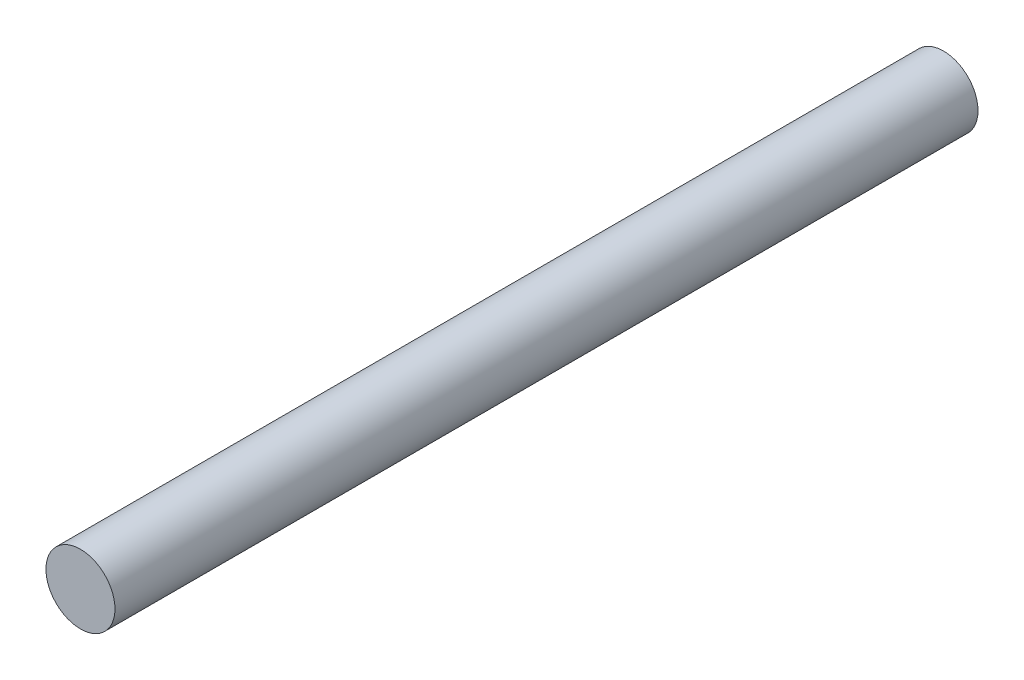
ISO-10303-21;
HEADER;
FILE_DESCRIPTION(('STEP AP214'),'2;1');
FILE_NAME('part.step','',(''),(''),'','','');
FILE_SCHEMA(('AUTOMOTIVE_DESIGN { 1 0 10303 214 1 1 1 1 }'));
ENDSEC;
DATA;
#1=APPLICATION_CONTEXT('core data for automotive mechanical design processes');
#2=APPLICATION_PROTOCOL_DEFINITION('international standard','automotive_design',2000,#1);
#3=PRODUCT_CONTEXT('',#1,'mechanical');
#4=PRODUCT('Part','Part','',(#3));
#5=PRODUCT_RELATED_PRODUCT_CATEGORY('part','',(#4));
#6=PRODUCT_DEFINITION_FORMATION('','',#4);
#7=PRODUCT_DEFINITION_CONTEXT('part definition',#1,'design');
#8=PRODUCT_DEFINITION('design','',#6,#7);
#9=PRODUCT_DEFINITION_SHAPE('','',#8);
#10=(LENGTH_UNIT() NAMED_UNIT(*) SI_UNIT(.MILLI.,.METRE.));
#11=(NAMED_UNIT(*) PLANE_ANGLE_UNIT() SI_UNIT($,.RADIAN.));
#12=(NAMED_UNIT(*) SI_UNIT($,.STERADIAN.) SOLID_ANGLE_UNIT());
#13=UNCERTAINTY_MEASURE_WITH_UNIT(LENGTH_MEASURE(1.E-05),#10,'distance_accuracy_value','');
#14=(GEOMETRIC_REPRESENTATION_CONTEXT(3) GLOBAL_UNCERTAINTY_ASSIGNED_CONTEXT((#13)) GLOBAL_UNIT_ASSIGNED_CONTEXT((#10,
#11,#12)) REPRESENTATION_CONTEXT('',''));
#15=CARTESIAN_POINT('',(0.,0.,0.));
#16=DIRECTION('',(0.,0.,1.));
#17=DIRECTION('',(1.,0.,0.));
#18=AXIS2_PLACEMENT_3D('',#15,#16,#17);
#19=CARTESIAN_POINT('',(0.,0.,187.51));
#20=DIRECTION('',(0.,0.,-1.));
#21=DIRECTION('',(-1.,0.,0.));
#22=AXIS2_PLACEMENT_3D('',#19,#20,#21);
#23=CYLINDRICAL_SURFACE('',#22,7.5);
#24=CARTESIAN_POINT('',(0.,0.,187.51));
#25=DIRECTION('',(0.,0.,1.));
#26=DIRECTION('',(1.,0.,0.));
#27=AXIS2_PLACEMENT_3D('',#24,#25,#26);
#28=CIRCLE('',#27,7.5);
#29=CARTESIAN_POINT('',(7.5,0.,187.51));
#30=VERTEX_POINT('',#29);
#31=EDGE_CURVE('E10',#30,#30,#28,.T.);
#32=ORIENTED_EDGE('',*,*,#31,.F.);
#33=EDGE_LOOP('',(#32));
#34=FACE_BOUND('',#33,.T.);
#35=CARTESIAN_POINT('',(0.,0.,0.));
#36=DIRECTION('',(0.,0.,1.));
#37=DIRECTION('',(1.,0.,0.));
#38=AXIS2_PLACEMENT_3D('',#35,#36,#37);
#39=CIRCLE('',#38,7.5);
#40=CARTESIAN_POINT('',(7.5,0.,0.));
#41=VERTEX_POINT('',#40);
#42=EDGE_CURVE('E48',#41,#41,#39,.T.);
#43=ORIENTED_EDGE('',*,*,#42,.T.);
#44=EDGE_LOOP('',(#43));
#45=FACE_BOUND('',#44,.T.);
#46=ADVANCED_FACE('F45',(#34,#45),#23,.T.);
#47=CARTESIAN_POINT('',(0.,0.,187.51));
#48=DIRECTION('',(0.,0.,1.));
#49=DIRECTION('',(1.,0.,0.));
#50=AXIS2_PLACEMENT_3D('',#47,#48,#49);
#51=PLANE('',#50);
#52=ORIENTED_EDGE('',*,*,#31,.T.);
#53=EDGE_LOOP('',(#52));
#54=FACE_BOUND('',#53,.T.);
#55=ADVANCED_FACE('F62',(#54),#51,.T.);
#56=CARTESIAN_POINT('',(0.,0.,0.));
#57=DIRECTION('',(0.,0.,1.));
#58=DIRECTION('',(1.,0.,0.));
#59=AXIS2_PLACEMENT_3D('',#56,#57,#58);
#60=PLANE('',#59);
#61=ORIENTED_EDGE('',*,*,#42,.F.);
#62=EDGE_LOOP('',(#61));
#63=FACE_BOUND('',#62,.T.);
#64=ADVANCED_FACE('F60',(#63),#60,.F.);
#65=CLOSED_SHELL('',(#46,#55,#64));
#66=MANIFOLD_SOLID_BREP('B2',#65);
#67=ADVANCED_BREP_SHAPE_REPRESENTATION('',(#18,#66),#14);
#68=SHAPE_DEFINITION_REPRESENTATION(#9,#67);
ENDSEC;
END-ISO-10303-21;
